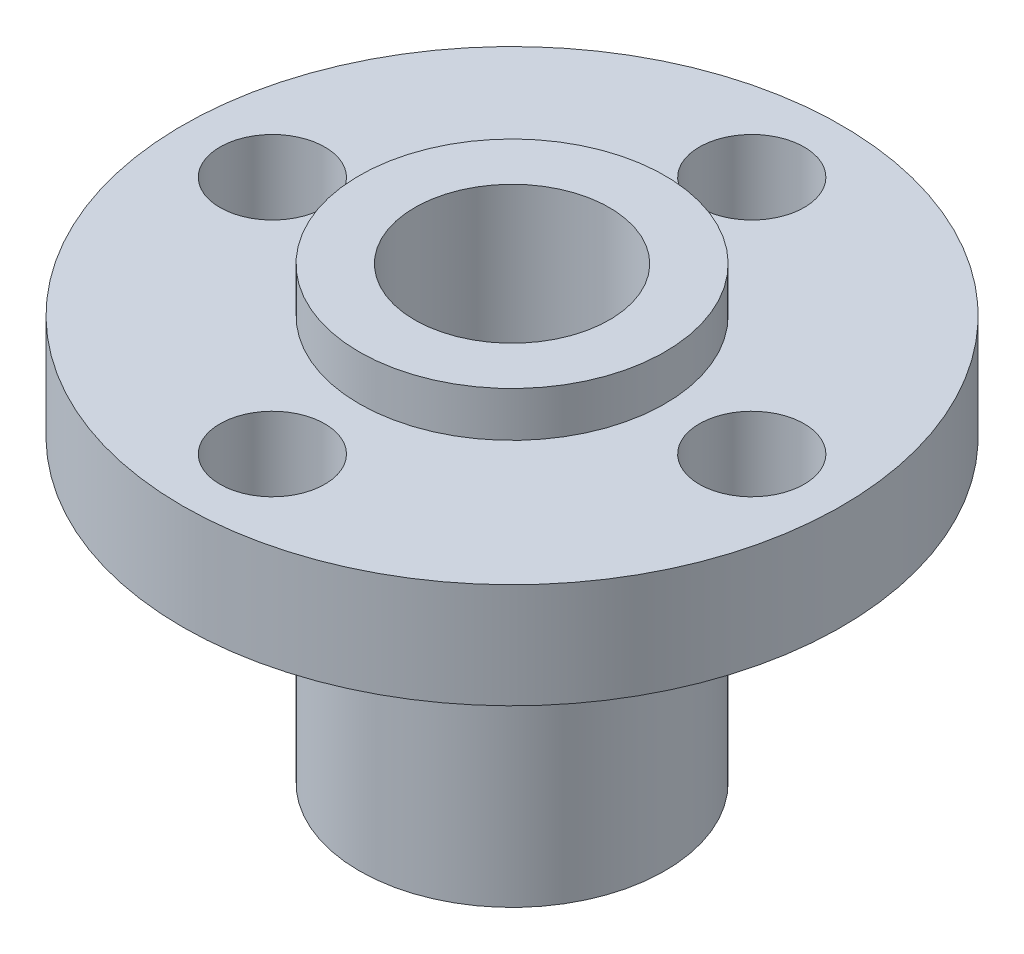
ISO-10303-21;
HEADER;
FILE_DESCRIPTION(('STEP AP214'),'2;1');
FILE_NAME('part.step','',(''),(''),'','','');
FILE_SCHEMA(('AUTOMOTIVE_DESIGN { 1 0 10303 214 1 1 1 1 }'));
ENDSEC;
DATA;
#1=APPLICATION_CONTEXT('core data for automotive mechanical design processes');
#2=APPLICATION_PROTOCOL_DEFINITION('international standard','automotive_design',2000,#1);
#3=PRODUCT_CONTEXT('',#1,'mechanical');
#4=PRODUCT('Part','Part','',(#3));
#5=PRODUCT_RELATED_PRODUCT_CATEGORY('part','',(#4));
#6=PRODUCT_DEFINITION_FORMATION('','',#4);
#7=PRODUCT_DEFINITION_CONTEXT('part definition',#1,'design');
#8=PRODUCT_DEFINITION('design','',#6,#7);
#9=PRODUCT_DEFINITION_SHAPE('','',#8);
#10=(LENGTH_UNIT() NAMED_UNIT(*) SI_UNIT(.MILLI.,.METRE.));
#11=(NAMED_UNIT(*) PLANE_ANGLE_UNIT() SI_UNIT($,.RADIAN.));
#12=(NAMED_UNIT(*) SI_UNIT($,.STERADIAN.) SOLID_ANGLE_UNIT());
#13=UNCERTAINTY_MEASURE_WITH_UNIT(LENGTH_MEASURE(1.E-05),#10,'distance_accuracy_value','');
#14=(GEOMETRIC_REPRESENTATION_CONTEXT(3) GLOBAL_UNCERTAINTY_ASSIGNED_CONTEXT((#13)) GLOBAL_UNIT_ASSIGNED_CONTEXT((#10,
#11,#12)) REPRESENTATION_CONTEXT('',''));
#15=CARTESIAN_POINT('',(0.,0.,0.));
#16=DIRECTION('',(0.,0.,1.));
#17=DIRECTION('',(1.,0.,0.));
#18=AXIS2_PLACEMENT_3D('',#15,#16,#17);
#19=CARTESIAN_POINT('',(0.,3.5,0.));
#20=DIRECTION('',(0.,-1.,0.));
#21=DIRECTION('',(0.,0.,-1.));
#22=AXIS2_PLACEMENT_3D('',#19,#20,#21);
#23=CYLINDRICAL_SURFACE('',#22,11.);
#24=CARTESIAN_POINT('',(0.,3.5,0.));
#25=DIRECTION('',(0.,1.,0.));
#26=DIRECTION('',(0.,0.,1.));
#27=AXIS2_PLACEMENT_3D('',#24,#25,#26);
#28=CIRCLE('',#27,11.);
#29=CARTESIAN_POINT('',(0.,3.5,11.));
#30=VERTEX_POINT('',#29);
#31=EDGE_CURVE('E46',#30,#30,#28,.T.);
#32=ORIENTED_EDGE('',*,*,#31,.F.);
#33=EDGE_LOOP('',(#32));
#34=FACE_BOUND('',#33,.T.);
#35=CARTESIAN_POINT('',(0.,0.,0.));
#36=DIRECTION('',(0.,1.,0.));
#37=DIRECTION('',(0.,0.,1.));
#38=AXIS2_PLACEMENT_3D('',#35,#36,#37);
#39=CIRCLE('',#38,11.);
#40=CARTESIAN_POINT('',(0.,0.,11.));
#41=VERTEX_POINT('',#40);
#42=EDGE_CURVE('E51',#41,#41,#39,.T.);
#43=ORIENTED_EDGE('',*,*,#42,.T.);
#44=EDGE_LOOP('',(#43));
#45=FACE_BOUND('',#44,.T.);
#46=ADVANCED_FACE('F39',(#34,#45),#23,.T.);
#47=CARTESIAN_POINT('',(0.,3.5,0.));
#48=DIRECTION('',(0.,1.,0.));
#49=DIRECTION('',(0.,0.,1.));
#50=AXIS2_PLACEMENT_3D('',#47,#48,#49);
#51=PLANE('',#50);
#52=CARTESIAN_POINT('',(-8.,3.5,0.));
#53=DIRECTION('',(0.,1.,0.));
#54=DIRECTION('',(0.,0.,1.));
#55=AXIS2_PLACEMENT_3D('',#52,#53,#54);
#56=CIRCLE('',#55,1.75);
#57=CARTESIAN_POINT('',(-8.,3.5,1.75));
#58=VERTEX_POINT('',#57);
#59=EDGE_CURVE('E66',#58,#58,#56,.T.);
#60=ORIENTED_EDGE('',*,*,#59,.F.);
#61=EDGE_LOOP('',(#60));
#62=FACE_BOUND('',#61,.T.);
#63=CARTESIAN_POINT('',(0.,3.5,-8.));
#64=DIRECTION('',(0.,1.,0.));
#65=DIRECTION('',(0.,0.,1.));
#66=AXIS2_PLACEMENT_3D('',#63,#64,#65);
#67=CIRCLE('',#66,1.75);
#68=CARTESIAN_POINT('',(0.,3.5,-6.25));
#69=VERTEX_POINT('',#68);
#70=EDGE_CURVE('E156',#69,#69,#67,.T.);
#71=ORIENTED_EDGE('',*,*,#70,.F.);
#72=EDGE_LOOP('',(#71));
#73=FACE_BOUND('',#72,.T.);
#74=CARTESIAN_POINT('',(8.,3.5,0.));
#75=DIRECTION('',(0.,1.,0.));
#76=DIRECTION('',(0.,0.,1.));
#77=AXIS2_PLACEMENT_3D('',#74,#75,#76);
#78=CIRCLE('',#77,1.75);
#79=CARTESIAN_POINT('',(8.,3.5,1.75000000000006));
#80=VERTEX_POINT('',#79);
#81=EDGE_CURVE('E159',#80,#80,#78,.T.);
#82=ORIENTED_EDGE('',*,*,#81,.F.);
#83=EDGE_LOOP('',(#82));
#84=FACE_BOUND('',#83,.T.);
#85=CARTESIAN_POINT('',(0.,3.5,8.));
#86=DIRECTION('',(0.,1.,0.));
#87=DIRECTION('',(0.,0.,1.));
#88=AXIS2_PLACEMENT_3D('',#85,#86,#87);
#89=CIRCLE('',#88,1.75);
#90=CARTESIAN_POINT('',(0.,3.5,9.75));
#91=VERTEX_POINT('',#90);
#92=EDGE_CURVE('E163',#91,#91,#89,.T.);
#93=ORIENTED_EDGE('',*,*,#92,.F.);
#94=EDGE_LOOP('',(#93));
#95=FACE_BOUND('',#94,.T.);
#96=CARTESIAN_POINT('',(0.,3.5,0.));
#97=DIRECTION('',(0.,1.,0.));
#98=DIRECTION('',(0.,0.,1.));
#99=AXIS2_PLACEMENT_3D('',#96,#97,#98);
#100=CIRCLE('',#99,5.1);
#101=CARTESIAN_POINT('',(0.,3.5,5.1));
#102=VERTEX_POINT('',#101);
#103=EDGE_CURVE('E10',#102,#102,#100,.T.);
#104=ORIENTED_EDGE('',*,*,#103,.F.);
#105=EDGE_LOOP('',(#104));
#106=FACE_BOUND('',#105,.T.);
#107=ORIENTED_EDGE('',*,*,#31,.T.);
#108=EDGE_LOOP('',(#107));
#109=FACE_BOUND('',#108,.T.);
#110=ADVANCED_FACE('F105',(#62,#73,#84,#95,#106,#109),#51,.T.);
#111=CARTESIAN_POINT('',(0.,0.,0.));
#112=DIRECTION('',(0.,1.,0.));
#113=DIRECTION('',(0.,0.,1.));
#114=AXIS2_PLACEMENT_3D('',#111,#112,#113);
#115=PLANE('',#114);
#116=CARTESIAN_POINT('',(-8.,0.,0.));
#117=DIRECTION('',(0.,1.,0.));
#118=DIRECTION('',(0.,0.,1.));
#119=AXIS2_PLACEMENT_3D('',#116,#117,#118);
#120=CIRCLE('',#119,1.75);
#121=CARTESIAN_POINT('',(-8.,0.,1.75));
#122=VERTEX_POINT('',#121);
#123=EDGE_CURVE('E42',#122,#122,#120,.T.);
#124=ORIENTED_EDGE('',*,*,#123,.T.);
#125=EDGE_LOOP('',(#124));
#126=FACE_BOUND('',#125,.T.);
#127=CARTESIAN_POINT('',(0.,0.,-8.));
#128=DIRECTION('',(0.,1.,0.));
#129=DIRECTION('',(0.,0.,1.));
#130=AXIS2_PLACEMENT_3D('',#127,#128,#129);
#131=CIRCLE('',#130,1.75);
#132=CARTESIAN_POINT('',(0.,0.,-6.25));
#133=VERTEX_POINT('',#132);
#134=EDGE_CURVE('E68',#133,#133,#131,.T.);
#135=ORIENTED_EDGE('',*,*,#134,.T.);
#136=EDGE_LOOP('',(#135));
#137=FACE_BOUND('',#136,.T.);
#138=CARTESIAN_POINT('',(8.,0.,0.));
#139=DIRECTION('',(0.,1.,0.));
#140=DIRECTION('',(0.,0.,1.));
#141=AXIS2_PLACEMENT_3D('',#138,#139,#140);
#142=CIRCLE('',#141,1.75);
#143=CARTESIAN_POINT('',(8.,0.,1.75000000000006));
#144=VERTEX_POINT('',#143);
#145=EDGE_CURVE('E65',#144,#144,#142,.T.);
#146=ORIENTED_EDGE('',*,*,#145,.T.);
#147=EDGE_LOOP('',(#146));
#148=FACE_BOUND('',#147,.T.);
#149=CARTESIAN_POINT('',(0.,0.,8.));
#150=DIRECTION('',(0.,1.,0.));
#151=DIRECTION('',(0.,0.,1.));
#152=AXIS2_PLACEMENT_3D('',#149,#150,#151);
#153=CIRCLE('',#152,1.75);
#154=CARTESIAN_POINT('',(0.,0.,9.75));
#155=VERTEX_POINT('',#154);
#156=EDGE_CURVE('E62',#155,#155,#153,.T.);
#157=ORIENTED_EDGE('',*,*,#156,.T.);
#158=EDGE_LOOP('',(#157));
#159=FACE_BOUND('',#158,.T.);
#160=CARTESIAN_POINT('',(0.,0.,0.));
#161=DIRECTION('',(0.,1.,0.));
#162=DIRECTION('',(0.,0.,1.));
#163=AXIS2_PLACEMENT_3D('',#160,#161,#162);
#164=CIRCLE('',#163,5.1);
#165=CARTESIAN_POINT('',(0.,0.,5.1));
#166=VERTEX_POINT('',#165);
#167=EDGE_CURVE('E59',#166,#166,#164,.T.);
#168=ORIENTED_EDGE('',*,*,#167,.T.);
#169=EDGE_LOOP('',(#168));
#170=FACE_BOUND('',#169,.T.);
#171=ORIENTED_EDGE('',*,*,#42,.F.);
#172=EDGE_LOOP('',(#171));
#173=FACE_BOUND('',#172,.T.);
#174=ADVANCED_FACE('F96',(#126,#137,#148,#159,#170,#173),#115,.F.);
#175=CARTESIAN_POINT('',(0.,-10.,0.));
#176=DIRECTION('',(0.,1.,0.));
#177=DIRECTION('',(0.,0.,1.));
#178=AXIS2_PLACEMENT_3D('',#175,#176,#177);
#179=PLANE('',#178);
#180=CARTESIAN_POINT('',(0.,-10.,0.));
#181=DIRECTION('',(0.,1.,0.));
#182=DIRECTION('',(0.,0.,1.));
#183=AXIS2_PLACEMENT_3D('',#180,#181,#182);
#184=CIRCLE('',#183,3.25);
#185=CARTESIAN_POINT('',(0.,-10.,3.25));
#186=VERTEX_POINT('',#185);
#187=EDGE_CURVE('E77',#186,#186,#184,.T.);
#188=ORIENTED_EDGE('',*,*,#187,.T.);
#189=EDGE_LOOP('',(#188));
#190=FACE_BOUND('',#189,.T.);
#191=CARTESIAN_POINT('',(0.,-10.,0.));
#192=DIRECTION('',(0.,1.,0.));
#193=DIRECTION('',(0.,0.,1.));
#194=AXIS2_PLACEMENT_3D('',#191,#192,#193);
#195=CIRCLE('',#194,5.1);
#196=CARTESIAN_POINT('',(0.,-10.,5.1));
#197=VERTEX_POINT('',#196);
#198=EDGE_CURVE('E54',#197,#197,#195,.T.);
#199=ORIENTED_EDGE('',*,*,#198,.F.);
#200=EDGE_LOOP('',(#199));
#201=FACE_BOUND('',#200,.T.);
#202=ADVANCED_FACE('F94',(#190,#201),#179,.F.);
#203=CARTESIAN_POINT('',(0.,-10.,0.));
#204=DIRECTION('',(0.,1.,0.));
#205=DIRECTION('',(0.,0.,1.));
#206=AXIS2_PLACEMENT_3D('',#203,#204,#205);
#207=CYLINDRICAL_SURFACE('',#206,5.1);
#208=ORIENTED_EDGE('',*,*,#198,.T.);
#209=EDGE_LOOP('',(#208));
#210=FACE_BOUND('',#209,.T.);
#211=ORIENTED_EDGE('',*,*,#167,.F.);
#212=EDGE_LOOP('',(#211));
#213=FACE_BOUND('',#212,.T.);
#214=ADVANCED_FACE('F91',(#210,#213),#207,.T.);
#215=ORIENTED_EDGE('',*,*,#103,.T.);
#216=EDGE_LOOP('',(#215));
#217=FACE_BOUND('',#216,.T.);
#218=CARTESIAN_POINT('',(0.,5.,0.));
#219=DIRECTION('',(0.,1.,0.));
#220=DIRECTION('',(0.,0.,1.));
#221=AXIS2_PLACEMENT_3D('',#218,#219,#220);
#222=CIRCLE('',#221,5.1);
#223=CARTESIAN_POINT('',(0.,5.,5.1));
#224=VERTEX_POINT('',#223);
#225=EDGE_CURVE('E82',#224,#224,#222,.T.);
#226=ORIENTED_EDGE('',*,*,#225,.F.);
#227=EDGE_LOOP('',(#226));
#228=FACE_BOUND('',#227,.T.);
#229=ADVANCED_FACE('F103',(#217,#228),#207,.T.);
#230=CARTESIAN_POINT('',(0.,5.,0.));
#231=DIRECTION('',(0.,1.,0.));
#232=DIRECTION('',(0.,0.,1.));
#233=AXIS2_PLACEMENT_3D('',#230,#231,#232);
#234=PLANE('',#233);
#235=CARTESIAN_POINT('',(0.,5.,0.));
#236=DIRECTION('',(0.,1.,0.));
#237=DIRECTION('',(0.,0.,1.));
#238=AXIS2_PLACEMENT_3D('',#235,#236,#237);
#239=CIRCLE('',#238,3.25);
#240=CARTESIAN_POINT('',(0.,5.,3.25));
#241=VERTEX_POINT('',#240);
#242=EDGE_CURVE('E73',#241,#241,#239,.T.);
#243=ORIENTED_EDGE('',*,*,#242,.F.);
#244=EDGE_LOOP('',(#243));
#245=FACE_BOUND('',#244,.T.);
#246=ORIENTED_EDGE('',*,*,#225,.T.);
#247=EDGE_LOOP('',(#246));
#248=FACE_BOUND('',#247,.T.);
#249=ADVANCED_FACE('F124',(#245,#248),#234,.T.);
#250=CARTESIAN_POINT('',(0.,-10.,0.));
#251=DIRECTION('',(0.,1.,0.));
#252=DIRECTION('',(0.,0.,1.));
#253=AXIS2_PLACEMENT_3D('',#250,#251,#252);
#254=CYLINDRICAL_SURFACE('',#253,3.25);
#255=ORIENTED_EDGE('',*,*,#187,.F.);
#256=EDGE_LOOP('',(#255));
#257=FACE_BOUND('',#256,.T.);
#258=ORIENTED_EDGE('',*,*,#242,.T.);
#259=EDGE_LOOP('',(#258));
#260=FACE_BOUND('',#259,.T.);
#261=ADVANCED_FACE('F128',(#257,#260),#254,.F.);
#262=CARTESIAN_POINT('',(0.,-10.,8.));
#263=DIRECTION('',(0.,1.,0.));
#264=DIRECTION('',(0.,0.,1.));
#265=AXIS2_PLACEMENT_3D('',#262,#263,#264);
#266=CYLINDRICAL_SURFACE('',#265,1.75);
#267=ORIENTED_EDGE('',*,*,#92,.T.);
#268=EDGE_LOOP('',(#267));
#269=FACE_BOUND('',#268,.T.);
#270=ORIENTED_EDGE('',*,*,#156,.F.);
#271=EDGE_LOOP('',(#270));
#272=FACE_BOUND('',#271,.T.);
#273=ADVANCED_FACE('F134',(#269,#272),#266,.F.);
#274=CARTESIAN_POINT('',(8.,-10.,0.));
#275=DIRECTION('',(0.,1.,0.));
#276=DIRECTION('',(0.,0.,1.));
#277=AXIS2_PLACEMENT_3D('',#274,#275,#276);
#278=CYLINDRICAL_SURFACE('',#277,1.75);
#279=ORIENTED_EDGE('',*,*,#81,.T.);
#280=EDGE_LOOP('',(#279));
#281=FACE_BOUND('',#280,.T.);
#282=ORIENTED_EDGE('',*,*,#145,.F.);
#283=EDGE_LOOP('',(#282));
#284=FACE_BOUND('',#283,.T.);
#285=ADVANCED_FACE('F140',(#281,#284),#278,.F.);
#286=CARTESIAN_POINT('',(0.,-10.,-8.));
#287=DIRECTION('',(0.,1.,0.));
#288=DIRECTION('',(0.,0.,1.));
#289=AXIS2_PLACEMENT_3D('',#286,#287,#288);
#290=CYLINDRICAL_SURFACE('',#289,1.75);
#291=ORIENTED_EDGE('',*,*,#70,.T.);
#292=EDGE_LOOP('',(#291));
#293=FACE_BOUND('',#292,.T.);
#294=ORIENTED_EDGE('',*,*,#134,.F.);
#295=EDGE_LOOP('',(#294));
#296=FACE_BOUND('',#295,.T.);
#297=ADVANCED_FACE('F144',(#293,#296),#290,.F.);
#298=CARTESIAN_POINT('',(-8.,-10.,0.));
#299=DIRECTION('',(0.,1.,0.));
#300=DIRECTION('',(0.,0.,1.));
#301=AXIS2_PLACEMENT_3D('',#298,#299,#300);
#302=CYLINDRICAL_SURFACE('',#301,1.75);
#303=ORIENTED_EDGE('',*,*,#59,.T.);
#304=EDGE_LOOP('',(#303));
#305=FACE_BOUND('',#304,.T.);
#306=ORIENTED_EDGE('',*,*,#123,.F.);
#307=EDGE_LOOP('',(#306));
#308=FACE_BOUND('',#307,.T.);
#309=ADVANCED_FACE('F148',(#305,#308),#302,.F.);
#310=CLOSED_SHELL('',(#46,#110,#174,#202,#214,#229,#249,#261,#273,#285,#297,#309));
#311=MANIFOLD_SOLID_BREP('B2',#310);
#312=ADVANCED_BREP_SHAPE_REPRESENTATION('',(#18,#311),#14);
#313=SHAPE_DEFINITION_REPRESENTATION(#9,#312);
ENDSEC;
END-ISO-10303-21;
